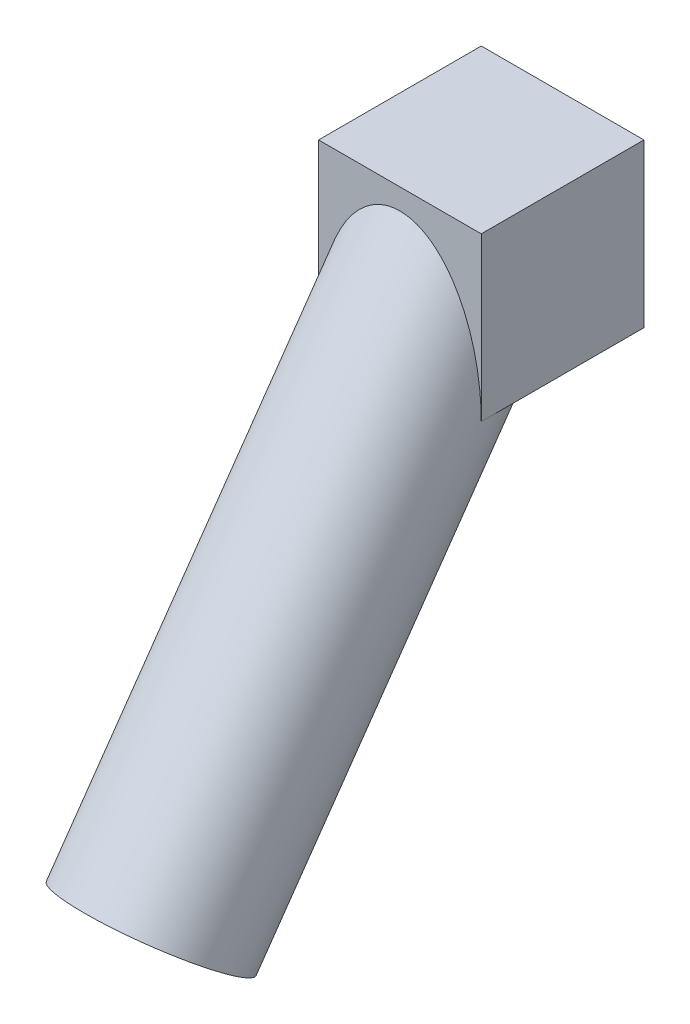
ISO-10303-21;
HEADER;
FILE_DESCRIPTION(('STEP AP214'),'2;1');
FILE_NAME('part.step','',(''),(''),'','','');
FILE_SCHEMA(('AUTOMOTIVE_DESIGN { 1 0 10303 214 1 1 1 1 }'));
ENDSEC;
DATA;
#1=APPLICATION_CONTEXT('core data for automotive mechanical design processes');
#2=APPLICATION_PROTOCOL_DEFINITION('international standard','automotive_design',2000,#1);
#3=PRODUCT_CONTEXT('',#1,'mechanical');
#4=PRODUCT('Part','Part','',(#3));
#5=PRODUCT_RELATED_PRODUCT_CATEGORY('part','',(#4));
#6=PRODUCT_DEFINITION_FORMATION('','',#4);
#7=PRODUCT_DEFINITION_CONTEXT('part definition',#1,'design');
#8=PRODUCT_DEFINITION('design','',#6,#7);
#9=PRODUCT_DEFINITION_SHAPE('','',#8);
#10=(LENGTH_UNIT() NAMED_UNIT(*) SI_UNIT(.MILLI.,.METRE.));
#11=(NAMED_UNIT(*) PLANE_ANGLE_UNIT() SI_UNIT($,.RADIAN.));
#12=(NAMED_UNIT(*) SI_UNIT($,.STERADIAN.) SOLID_ANGLE_UNIT());
#13=UNCERTAINTY_MEASURE_WITH_UNIT(LENGTH_MEASURE(1.E-05),#10,'distance_accuracy_value','');
#14=(GEOMETRIC_REPRESENTATION_CONTEXT(3) GLOBAL_UNCERTAINTY_ASSIGNED_CONTEXT((#13)) GLOBAL_UNIT_ASSIGNED_CONTEXT((#10,
#11,#12)) REPRESENTATION_CONTEXT('',''));
#15=CARTESIAN_POINT('',(0.,0.,0.));
#16=DIRECTION('',(0.,0.,1.));
#17=DIRECTION('',(1.,0.,0.));
#18=AXIS2_PLACEMENT_3D('',#15,#16,#17);
#19=CARTESIAN_POINT('',(0.,15.,0.));
#20=DIRECTION('',(1.,0.,0.));
#21=DIRECTION('',(0.,0.,-1.));
#22=AXIS2_PLACEMENT_3D('',#19,#20,#21);
#23=PLANE('',#22);
#24=DIRECTION('',(0.,0.,1.));
#25=VECTOR('',#24,1.);
#26=CARTESIAN_POINT('',(0.,0.,0.));
#27=LINE('',#26,#25);
#28=CARTESIAN_POINT('',(0.,0.,-15.));
#29=VERTEX_POINT('',#28);
#30=CARTESIAN_POINT('',(0.,0.,0.));
#31=VERTEX_POINT('',#30);
#32=EDGE_CURVE('E91',#29,#31,#27,.T.);
#33=ORIENTED_EDGE('',*,*,#32,.T.);
#34=DIRECTION('',(0.,-1.,0.));
#35=VECTOR('',#34,1.);
#36=CARTESIAN_POINT('',(0.,15.,0.));
#37=LINE('',#36,#35);
#38=CARTESIAN_POINT('',(0.,15.,0.));
#39=VERTEX_POINT('',#38);
#40=EDGE_CURVE('E48',#39,#31,#37,.T.);
#41=ORIENTED_EDGE('',*,*,#40,.F.);
#42=DIRECTION('',(0.,0.,1.));
#43=VECTOR('',#42,1.);
#44=CARTESIAN_POINT('',(0.,15.,0.));
#45=LINE('',#44,#43);
#46=CARTESIAN_POINT('',(0.,15.,-15.));
#47=VERTEX_POINT('',#46);
#48=EDGE_CURVE('E139',#47,#39,#45,.T.);
#49=ORIENTED_EDGE('',*,*,#48,.F.);
#50=DIRECTION('',(0.,-1.,0.));
#51=VECTOR('',#50,1.);
#52=CARTESIAN_POINT('',(0.,15.,-15.));
#53=LINE('',#52,#51);
#54=EDGE_CURVE('E131',#47,#29,#53,.T.);
#55=ORIENTED_EDGE('',*,*,#54,.T.);
#56=EDGE_LOOP('',(#33,#41,#49,#55));
#57=FACE_BOUND('',#56,.T.);
#58=ADVANCED_FACE('F39',(#57),#23,.F.);
#59=CARTESIAN_POINT('',(0.,15.,0.));
#60=DIRECTION('',(0.,0.,-1.));
#61=DIRECTION('',(-1.,0.,0.));
#62=AXIS2_PLACEMENT_3D('',#59,#60,#61);
#63=PLANE('',#62);
#64=ORIENTED_EDGE('',*,*,#40,.T.);
#65=CARTESIAN_POINT('',(7.5,0.,0.));
#66=DIRECTION('',(0.,0.,-1.));
#67=DIRECTION('',(0.,-1.,0.));
#68=AXIS2_PLACEMENT_3D('',#65,#66,#67);
#69=ELLIPSE('',#68,13.0758509671585,7.5);
#70=CARTESIAN_POINT('',(15.,0.,0.));
#71=VERTEX_POINT('',#70);
#72=EDGE_CURVE('E102',#31,#71,#69,.T.);
#73=ORIENTED_EDGE('',*,*,#72,.T.);
#74=DIRECTION('',(0.,-1.,0.));
#75=VECTOR('',#74,1.);
#76=CARTESIAN_POINT('',(15.,15.,0.));
#77=LINE('',#76,#75);
#78=CARTESIAN_POINT('',(15.,15.,0.));
#79=VERTEX_POINT('',#78);
#80=EDGE_CURVE('E94',#79,#71,#77,.T.);
#81=ORIENTED_EDGE('',*,*,#80,.F.);
#82=DIRECTION('',(1.,0.,0.));
#83=VECTOR('',#82,1.);
#84=CARTESIAN_POINT('',(0.,15.,0.));
#85=LINE('',#84,#83);
#86=EDGE_CURVE('E85',#39,#79,#85,.T.);
#87=ORIENTED_EDGE('',*,*,#86,.F.);
#88=EDGE_LOOP('',(#64,#73,#81,#87));
#89=FACE_BOUND('',#88,.T.);
#90=ADVANCED_FACE('F103',(#89),#63,.F.);
#91=CARTESIAN_POINT('',(15.,15.,0.));
#92=DIRECTION('',(-1.,0.,0.));
#93=DIRECTION('',(0.,0.,1.));
#94=AXIS2_PLACEMENT_3D('',#91,#92,#93);
#95=PLANE('',#94);
#96=ORIENTED_EDGE('',*,*,#80,.T.);
#97=DIRECTION('',(0.,0.,-1.));
#98=VECTOR('',#97,1.);
#99=CARTESIAN_POINT('',(15.,0.,0.));
#100=LINE('',#99,#98);
#101=CARTESIAN_POINT('',(15.,0.,-15.));
#102=VERTEX_POINT('',#101);
#103=EDGE_CURVE('E71',#71,#102,#100,.T.);
#104=ORIENTED_EDGE('',*,*,#103,.T.);
#105=DIRECTION('',(0.,-1.,0.));
#106=VECTOR('',#105,1.);
#107=CARTESIAN_POINT('',(15.,15.,-15.));
#108=LINE('',#107,#106);
#109=CARTESIAN_POINT('',(15.,15.,-15.));
#110=VERTEX_POINT('',#109);
#111=EDGE_CURVE('E99',#110,#102,#108,.T.);
#112=ORIENTED_EDGE('',*,*,#111,.F.);
#113=DIRECTION('',(0.,0.,-1.));
#114=VECTOR('',#113,1.);
#115=CARTESIAN_POINT('',(15.,15.,0.));
#116=LINE('',#115,#114);
#117=EDGE_CURVE('E97',#79,#110,#116,.T.);
#118=ORIENTED_EDGE('',*,*,#117,.F.);
#119=EDGE_LOOP('',(#96,#104,#112,#118));
#120=FACE_BOUND('',#119,.T.);
#121=ADVANCED_FACE('F96',(#120),#95,.F.);
#122=CARTESIAN_POINT('',(0.,15.,-15.));
#123=DIRECTION('',(0.,0.,1.));
#124=DIRECTION('',(1.,0.,0.));
#125=AXIS2_PLACEMENT_3D('',#122,#123,#124);
#126=PLANE('',#125);
#127=DIRECTION('',(-1.,0.,0.));
#128=VECTOR('',#127,1.);
#129=CARTESIAN_POINT('',(0.,0.,-15.));
#130=LINE('',#129,#128);
#131=EDGE_CURVE('E77',#102,#29,#130,.T.);
#132=ORIENTED_EDGE('',*,*,#131,.T.);
#133=ORIENTED_EDGE('',*,*,#54,.F.);
#134=DIRECTION('',(-1.,0.,0.));
#135=VECTOR('',#134,1.);
#136=CARTESIAN_POINT('',(0.,15.,-15.));
#137=LINE('',#136,#135);
#138=EDGE_CURVE('E56',#110,#47,#137,.T.);
#139=ORIENTED_EDGE('',*,*,#138,.F.);
#140=ORIENTED_EDGE('',*,*,#111,.T.);
#141=EDGE_LOOP('',(#132,#133,#139,#140));
#142=FACE_BOUND('',#141,.T.);
#143=ADVANCED_FACE('F153',(#142),#126,.F.);
#144=CARTESIAN_POINT('',(0.,15.,0.));
#145=DIRECTION('',(0.,-1.,0.));
#146=DIRECTION('',(0.,0.,-1.));
#147=AXIS2_PLACEMENT_3D('',#144,#145,#146);
#148=PLANE('',#147);
#149=ORIENTED_EDGE('',*,*,#48,.T.);
#150=ORIENTED_EDGE('',*,*,#86,.T.);
#151=ORIENTED_EDGE('',*,*,#117,.T.);
#152=ORIENTED_EDGE('',*,*,#138,.T.);
#153=EDGE_LOOP('',(#149,#150,#151,#152));
#154=FACE_BOUND('',#153,.T.);
#155=ADVANCED_FACE('F121',(#154),#148,.F.);
#156=CARTESIAN_POINT('',(0.,0.,0.));
#157=DIRECTION('',(0.,-1.,0.));
#158=DIRECTION('',(0.,0.,-1.));
#159=AXIS2_PLACEMENT_3D('',#156,#157,#158);
#160=PLANE('',#159);
#161=CARTESIAN_POINT('',(7.5,0.,0.));
#162=DIRECTION('',(0.,-1.,0.));
#163=DIRECTION('',(0.,0.,1.));
#164=AXIS2_PLACEMENT_3D('',#161,#162,#163);
#165=ELLIPSE('',#164,9.15580941571084,7.5);
#166=EDGE_CURVE('E11',#31,#71,#165,.T.);
#167=ORIENTED_EDGE('',*,*,#166,.F.);
#168=ORIENTED_EDGE('',*,*,#32,.F.);
#169=ORIENTED_EDGE('',*,*,#131,.F.);
#170=ORIENTED_EDGE('',*,*,#103,.F.);
#171=EDGE_LOOP('',(#167,#168,#169,#170));
#172=FACE_BOUND('',#171,.T.);
#173=ADVANCED_FACE('F88',(#172),#160,.T.);
#174=CARTESIAN_POINT('',(7.5,9.82982453146799,-6.88291723621243));
#175=DIRECTION('',(0.,-0.819152044288999,0.573576436351036));
#176=DIRECTION('',(0.,-0.573576436351036,-0.819152044288999));
#177=AXIS2_PLACEMENT_3D('',#174,#175,#176);
#178=CYLINDRICAL_SURFACE('',#177,7.5);
#179=CARTESIAN_POINT('',(7.5,-32.76608177156,22.9430574540414));
#180=DIRECTION('',(0.,-0.819152044288999,0.573576436351036));
#181=DIRECTION('',(0.,-0.573576436351036,-0.819152044288999));
#182=AXIS2_PLACEMENT_3D('',#179,#180,#181);
#183=CIRCLE('',#182,7.5);
#184=CARTESIAN_POINT('',(7.5,-37.0679050441927,16.7994171218739));
#185=VERTEX_POINT('',#184);
#186=EDGE_CURVE('E108',#185,#185,#183,.T.);
#187=ORIENTED_EDGE('',*,*,#186,.F.);
#188=EDGE_LOOP('',(#187));
#189=FACE_BOUND('',#188,.T.);
#190=ORIENTED_EDGE('',*,*,#72,.F.);
#191=ORIENTED_EDGE('',*,*,#166,.T.);
#192=EDGE_LOOP('',(#190,#191));
#193=FACE_BOUND('',#192,.T.);
#194=ADVANCED_FACE('F110',(#189,#193),#178,.T.);
#195=CARTESIAN_POINT('',(7.5,-32.76608177156,22.9430574540414));
#196=DIRECTION('',(0.,-0.819152044288999,0.573576436351036));
#197=DIRECTION('',(0.,-0.573576436351036,-0.819152044288999));
#198=AXIS2_PLACEMENT_3D('',#195,#196,#197);
#199=PLANE('',#198);
#200=ORIENTED_EDGE('',*,*,#186,.T.);
#201=EDGE_LOOP('',(#200));
#202=FACE_BOUND('',#201,.T.);
#203=ADVANCED_FACE('F112',(#202),#199,.T.);
#204=CLOSED_SHELL('',(#58,#90,#121,#143,#155,#173,#194,#203));
#205=MANIFOLD_SOLID_BREP('B2',#204);
#206=ADVANCED_BREP_SHAPE_REPRESENTATION('',(#18,#205),#14);
#207=SHAPE_DEFINITION_REPRESENTATION(#9,#206);
ENDSEC;
END-ISO-10303-21;
